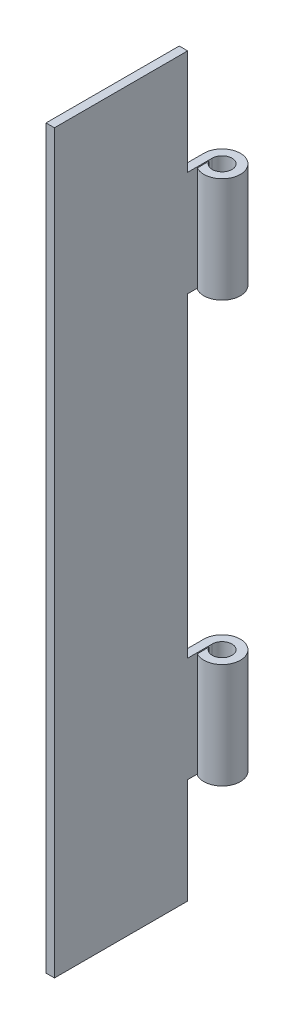
ISO-10303-21;
HEADER;
FILE_DESCRIPTION(('STEP AP214'),'2;1');
FILE_NAME('part.step','',(''),(''),'','','');
FILE_SCHEMA(('AUTOMOTIVE_DESIGN { 1 0 10303 214 1 1 1 1 }'));
ENDSEC;
DATA;
#1=APPLICATION_CONTEXT('core data for automotive mechanical design processes');
#2=APPLICATION_PROTOCOL_DEFINITION('international standard','automotive_design',2000,#1);
#3=PRODUCT_CONTEXT('',#1,'mechanical');
#4=PRODUCT('Part','Part','',(#3));
#5=PRODUCT_RELATED_PRODUCT_CATEGORY('part','',(#4));
#6=PRODUCT_DEFINITION_FORMATION('','',#4);
#7=PRODUCT_DEFINITION_CONTEXT('part definition',#1,'design');
#8=PRODUCT_DEFINITION('design','',#6,#7);
#9=PRODUCT_DEFINITION_SHAPE('','',#8);
#10=(LENGTH_UNIT() NAMED_UNIT(*) SI_UNIT(.MILLI.,.METRE.));
#11=(NAMED_UNIT(*) PLANE_ANGLE_UNIT() SI_UNIT($,.RADIAN.));
#12=(NAMED_UNIT(*) SI_UNIT($,.STERADIAN.) SOLID_ANGLE_UNIT());
#13=UNCERTAINTY_MEASURE_WITH_UNIT(LENGTH_MEASURE(1.E-05),#10,'distance_accuracy_value','');
#14=(GEOMETRIC_REPRESENTATION_CONTEXT(3) GLOBAL_UNCERTAINTY_ASSIGNED_CONTEXT((#13)) GLOBAL_UNIT_ASSIGNED_CONTEXT((#10,
#11,#12)) REPRESENTATION_CONTEXT('',''));
#15=CARTESIAN_POINT('',(0.,0.,0.));
#16=DIRECTION('',(0.,0.,1.));
#17=DIRECTION('',(1.,0.,0.));
#18=AXIS2_PLACEMENT_3D('',#15,#16,#17);
#19=CARTESIAN_POINT('',(0.,88.9,0.));
#20=DIRECTION('',(1.,0.,0.));
#21=DIRECTION('',(0.,0.,-1.));
#22=AXIS2_PLACEMENT_3D('',#19,#20,#21);
#23=PLANE('',#22);
#24=DIRECTION('',(0.,-1.,0.));
#25=VECTOR('',#24,1.);
#26=CARTESIAN_POINT('',(0.,63.5,2.968625));
#27=LINE('',#26,#25);
#28=CARTESIAN_POINT('',(0.,63.5,2.968625));
#29=VERTEX_POINT('',#28);
#30=CARTESIAN_POINT('',(0.,25.4,2.968625));
#31=VERTEX_POINT('',#30);
#32=EDGE_CURVE('E348',#29,#31,#27,.T.);
#33=ORIENTED_EDGE('',*,*,#32,.T.);
#34=DIRECTION('',(0.,0.,-1.));
#35=VECTOR('',#34,1.);
#36=CARTESIAN_POINT('',(0.,25.4,2.968625));
#37=LINE('',#36,#35);
#38=CARTESIAN_POINT('',(0.,25.4,0.));
#39=VERTEX_POINT('',#38);
#40=EDGE_CURVE('E357',#31,#39,#37,.T.);
#41=ORIENTED_EDGE('',*,*,#40,.T.);
#42=DIRECTION('',(0.,-1.,0.));
#43=VECTOR('',#42,1.);
#44=CARTESIAN_POINT('',(0.,88.9,0.));
#45=LINE('',#44,#43);
#46=CARTESIAN_POINT('',(0.,12.7,0.));
#47=VERTEX_POINT('',#46);
#48=EDGE_CURVE('E224',#39,#47,#45,.T.);
#49=ORIENTED_EDGE('',*,*,#48,.T.);
#50=DIRECTION('',(0.,0.,1.));
#51=VECTOR('',#50,1.);
#52=CARTESIAN_POINT('',(0.,12.7,2.968625));
#53=LINE('',#52,#51);
#54=CARTESIAN_POINT('',(0.,12.7,2.968625));
#55=VERTEX_POINT('',#54);
#56=EDGE_CURVE('E179',#47,#55,#53,.T.);
#57=ORIENTED_EDGE('',*,*,#56,.T.);
#58=DIRECTION('',(0.,-1.,0.));
#59=VECTOR('',#58,1.);
#60=CARTESIAN_POINT('',(0.,12.7,2.968625));
#61=LINE('',#60,#59);
#62=CARTESIAN_POINT('',(0.,0.,2.968625));
#63=VERTEX_POINT('',#62);
#64=EDGE_CURVE('E162',#55,#63,#61,.T.);
#65=ORIENTED_EDGE('',*,*,#64,.T.);
#66=DIRECTION('',(0.,0.,1.));
#67=VECTOR('',#66,1.);
#68=CARTESIAN_POINT('',(0.,0.,0.));
#69=LINE('',#68,#67);
#70=CARTESIAN_POINT('',(0.,0.,19.05));
#71=VERTEX_POINT('',#70);
#72=EDGE_CURVE('E176',#63,#71,#69,.T.);
#73=ORIENTED_EDGE('',*,*,#72,.T.);
#74=DIRECTION('',(0.,-1.,0.));
#75=VECTOR('',#74,1.);
#76=CARTESIAN_POINT('',(0.,88.9,19.05));
#77=LINE('',#76,#75);
#78=CARTESIAN_POINT('',(0.,88.9,19.05));
#79=VERTEX_POINT('',#78);
#80=EDGE_CURVE('E221',#79,#71,#77,.T.);
#81=ORIENTED_EDGE('',*,*,#80,.F.);
#82=DIRECTION('',(0.,0.,1.));
#83=VECTOR('',#82,1.);
#84=CARTESIAN_POINT('',(0.,88.9,0.));
#85=LINE('',#84,#83);
#86=CARTESIAN_POINT('',(0.,88.9,2.968625));
#87=VERTEX_POINT('',#86);
#88=EDGE_CURVE('E201',#87,#79,#85,.T.);
#89=ORIENTED_EDGE('',*,*,#88,.F.);
#90=DIRECTION('',(0.,-1.,0.));
#91=VECTOR('',#90,1.);
#92=CARTESIAN_POINT('',(0.,88.9,2.968625));
#93=LINE('',#92,#91);
#94=CARTESIAN_POINT('',(0.,76.2,2.968625));
#95=VERTEX_POINT('',#94);
#96=EDGE_CURVE('E69',#87,#95,#93,.T.);
#97=ORIENTED_EDGE('',*,*,#96,.T.);
#98=DIRECTION('',(0.,0.,-1.));
#99=VECTOR('',#98,1.);
#100=CARTESIAN_POINT('',(0.,76.2,2.968625));
#101=LINE('',#100,#99);
#102=CARTESIAN_POINT('',(0.,76.2,0.));
#103=VERTEX_POINT('',#102);
#104=EDGE_CURVE('E365',#95,#103,#101,.T.);
#105=ORIENTED_EDGE('',*,*,#104,.T.);
#106=CARTESIAN_POINT('',(0.,63.5,0.));
#107=VERTEX_POINT('',#106);
#108=EDGE_CURVE('E172',#103,#107,#45,.T.);
#109=ORIENTED_EDGE('',*,*,#108,.T.);
#110=DIRECTION('',(0.,0.,1.));
#111=VECTOR('',#110,1.);
#112=CARTESIAN_POINT('',(0.,63.5,2.968625));
#113=LINE('',#112,#111);
#114=EDGE_CURVE('E351',#107,#29,#113,.T.);
#115=ORIENTED_EDGE('',*,*,#114,.T.);
#116=EDGE_LOOP('',(#33,#41,#49,#57,#65,#73,#81,#89,#97,#105,#109,#115));
#117=FACE_BOUND('',#116,.T.);
#118=ADVANCED_FACE('F45',(#117),#23,.F.);
#119=CARTESIAN_POINT('',(1.016,88.9,19.05));
#120=DIRECTION('',(-1.,0.,0.));
#121=DIRECTION('',(0.,0.,1.));
#122=AXIS2_PLACEMENT_3D('',#119,#120,#121);
#123=PLANE('',#122);
#124=DIRECTION('',(0.,-1.,0.));
#125=VECTOR('',#124,1.);
#126=CARTESIAN_POINT('',(1.016,88.9,2.968625));
#127=LINE('',#126,#125);
#128=CARTESIAN_POINT('',(1.016,63.5,2.968625));
#129=VERTEX_POINT('',#128);
#130=CARTESIAN_POINT('',(1.016,25.4,2.968625));
#131=VERTEX_POINT('',#130);
#132=EDGE_CURVE('E11',#129,#131,#127,.T.);
#133=ORIENTED_EDGE('',*,*,#132,.F.);
#134=DIRECTION('',(0.,0.,1.));
#135=VECTOR('',#134,1.);
#136=CARTESIAN_POINT('',(1.016,63.5,19.05));
#137=LINE('',#136,#135);
#138=CARTESIAN_POINT('',(1.016,63.5,0.));
#139=VERTEX_POINT('',#138);
#140=EDGE_CURVE('E282',#139,#129,#137,.T.);
#141=ORIENTED_EDGE('',*,*,#140,.F.);
#142=DIRECTION('',(0.,-1.,0.));
#143=VECTOR('',#142,1.);
#144=CARTESIAN_POINT('',(1.016,88.9,0.));
#145=LINE('',#144,#143);
#146=CARTESIAN_POINT('',(1.016,76.2,0.));
#147=VERTEX_POINT('',#146);
#148=EDGE_CURVE('E216',#147,#139,#145,.T.);
#149=ORIENTED_EDGE('',*,*,#148,.F.);
#150=DIRECTION('',(0.,0.,-1.));
#151=VECTOR('',#150,1.);
#152=CARTESIAN_POINT('',(1.016,76.2,19.05));
#153=LINE('',#152,#151);
#154=CARTESIAN_POINT('',(1.016,76.2,2.968625));
#155=VERTEX_POINT('',#154);
#156=EDGE_CURVE('E273',#155,#147,#153,.T.);
#157=ORIENTED_EDGE('',*,*,#156,.F.);
#158=DIRECTION('',(0.,-1.,0.));
#159=VECTOR('',#158,1.);
#160=CARTESIAN_POINT('',(1.016,88.9,2.968625));
#161=LINE('',#160,#159);
#162=CARTESIAN_POINT('',(1.016,88.9,2.968625));
#163=VERTEX_POINT('',#162);
#164=EDGE_CURVE('E305',#163,#155,#161,.T.);
#165=ORIENTED_EDGE('',*,*,#164,.F.);
#166=DIRECTION('',(0.,0.,-1.));
#167=VECTOR('',#166,1.);
#168=CARTESIAN_POINT('',(1.016,88.9,19.05));
#169=LINE('',#168,#167);
#170=CARTESIAN_POINT('',(1.016,88.9,19.05));
#171=VERTEX_POINT('',#170);
#172=EDGE_CURVE('E196',#171,#163,#169,.T.);
#173=ORIENTED_EDGE('',*,*,#172,.F.);
#174=DIRECTION('',(0.,-1.,0.));
#175=VECTOR('',#174,1.);
#176=CARTESIAN_POINT('',(1.016,88.9,19.05));
#177=LINE('',#176,#175);
#178=CARTESIAN_POINT('',(1.016,0.,19.05));
#179=VERTEX_POINT('',#178);
#180=EDGE_CURVE('E217',#171,#179,#177,.T.);
#181=ORIENTED_EDGE('',*,*,#180,.T.);
#182=DIRECTION('',(0.,0.,-1.));
#183=VECTOR('',#182,1.);
#184=CARTESIAN_POINT('',(1.016,0.,19.05));
#185=LINE('',#184,#183);
#186=CARTESIAN_POINT('',(1.016,0.,2.968625));
#187=VERTEX_POINT('',#186);
#188=EDGE_CURVE('E191',#179,#187,#185,.T.);
#189=ORIENTED_EDGE('',*,*,#188,.T.);
#190=DIRECTION('',(0.,-1.,0.));
#191=VECTOR('',#190,1.);
#192=CARTESIAN_POINT('',(1.016,88.9,2.968625));
#193=LINE('',#192,#191);
#194=CARTESIAN_POINT('',(1.016,12.7,2.968625));
#195=VERTEX_POINT('',#194);
#196=EDGE_CURVE('E165',#195,#187,#193,.T.);
#197=ORIENTED_EDGE('',*,*,#196,.F.);
#198=DIRECTION('',(0.,0.,1.));
#199=VECTOR('',#198,1.);
#200=CARTESIAN_POINT('',(1.016,12.7,19.05));
#201=LINE('',#200,#199);
#202=CARTESIAN_POINT('',(1.016,12.7,0.));
#203=VERTEX_POINT('',#202);
#204=EDGE_CURVE('E193',#203,#195,#201,.T.);
#205=ORIENTED_EDGE('',*,*,#204,.F.);
#206=CARTESIAN_POINT('',(1.016,25.4,0.));
#207=VERTEX_POINT('',#206);
#208=EDGE_CURVE('E212',#207,#203,#145,.T.);
#209=ORIENTED_EDGE('',*,*,#208,.F.);
#210=DIRECTION('',(0.,0.,-1.));
#211=VECTOR('',#210,1.);
#212=CARTESIAN_POINT('',(1.016,25.4,19.05));
#213=LINE('',#212,#211);
#214=EDGE_CURVE('E266',#131,#207,#213,.T.);
#215=ORIENTED_EDGE('',*,*,#214,.F.);
#216=EDGE_LOOP('',(#133,#141,#149,#157,#165,#173,#181,#189,#197,#205,#209,#215));
#217=FACE_BOUND('',#216,.T.);
#218=ADVANCED_FACE('F303',(#217),#123,.F.);
#219=CARTESIAN_POINT('',(2.206625,88.9,0.));
#220=DIRECTION('',(0.,-1.,0.));
#221=DIRECTION('',(0.,0.,-1.));
#222=AXIS2_PLACEMENT_3D('',#219,#220,#221);
#223=CYLINDRICAL_SURFACE('',#222,2.206625);
#224=DIRECTION('',(0.,-1.,0.));
#225=VECTOR('',#224,1.);
#226=CARTESIAN_POINT('',(1.143,88.9,1.93336384315007));
#227=LINE('',#226,#225);
#228=CARTESIAN_POINT('',(1.143,25.4,1.93336384315007));
#229=VERTEX_POINT('',#228);
#230=CARTESIAN_POINT('',(1.143,12.7,1.93336384315007));
#231=VERTEX_POINT('',#230);
#232=EDGE_CURVE('E202',#229,#231,#227,.T.);
#233=ORIENTED_EDGE('',*,*,#232,.T.);
#234=CARTESIAN_POINT('',(2.206625,12.7,0.));
#235=DIRECTION('',(0.,-1.,0.));
#236=DIRECTION('',(0.,0.,-1.));
#237=AXIS2_PLACEMENT_3D('',#234,#235,#236);
#238=CIRCLE('',#237,2.206625);
#239=EDGE_CURVE('E187',#47,#231,#238,.T.);
#240=ORIENTED_EDGE('',*,*,#239,.F.);
#241=ORIENTED_EDGE('',*,*,#48,.F.);
#242=CARTESIAN_POINT('',(2.206625,25.4,0.));
#243=DIRECTION('',(0.,1.,0.));
#244=DIRECTION('',(0.,0.,1.));
#245=AXIS2_PLACEMENT_3D('',#242,#243,#244);
#246=CIRCLE('',#245,2.206625);
#247=EDGE_CURVE('E261',#229,#39,#246,.T.);
#248=ORIENTED_EDGE('',*,*,#247,.F.);
#249=EDGE_LOOP('',(#233,#240,#241,#248));
#250=FACE_BOUND('',#249,.T.);
#251=ADVANCED_FACE('F47',(#250),#223,.T.);
#252=CARTESIAN_POINT('',(1.143,76.2,1.93336384315007));
#253=VERTEX_POINT('',#252);
#254=CARTESIAN_POINT('',(1.143,63.5,1.93336384315007));
#255=VERTEX_POINT('',#254);
#256=EDGE_CURVE('E206',#253,#255,#227,.T.);
#257=ORIENTED_EDGE('',*,*,#256,.T.);
#258=CARTESIAN_POINT('',(2.206625,63.5,0.));
#259=DIRECTION('',(0.,-1.,0.));
#260=DIRECTION('',(0.,0.,-1.));
#261=AXIS2_PLACEMENT_3D('',#258,#259,#260);
#262=CIRCLE('',#261,2.206625);
#263=EDGE_CURVE('E61',#107,#255,#262,.T.);
#264=ORIENTED_EDGE('',*,*,#263,.F.);
#265=ORIENTED_EDGE('',*,*,#108,.F.);
#266=CARTESIAN_POINT('',(2.206625,76.2,0.));
#267=DIRECTION('',(0.,1.,0.));
#268=DIRECTION('',(0.,0.,1.));
#269=AXIS2_PLACEMENT_3D('',#266,#267,#268);
#270=CIRCLE('',#269,2.206625);
#271=EDGE_CURVE('E268',#253,#103,#270,.T.);
#272=ORIENTED_EDGE('',*,*,#271,.F.);
#273=EDGE_LOOP('',(#257,#264,#265,#272));
#274=FACE_BOUND('',#273,.T.);
#275=ADVANCED_FACE('F337',(#274),#223,.T.);
#276=CARTESIAN_POINT('',(2.206625,88.9,0.));
#277=DIRECTION('',(0.,-1.,0.));
#278=DIRECTION('',(0.,0.,-1.));
#279=AXIS2_PLACEMENT_3D('',#276,#277,#278);
#280=CYLINDRICAL_SURFACE('',#279,1.190625);
#281=CARTESIAN_POINT('',(2.206625,12.7,0.));
#282=DIRECTION('',(0.,-1.,0.));
#283=DIRECTION('',(0.,0.,-1.));
#284=AXIS2_PLACEMENT_3D('',#281,#282,#283);
#285=CIRCLE('',#284,1.190625);
#286=CARTESIAN_POINT('',(1.143,12.7,0.535060510596702));
#287=VERTEX_POINT('',#286);
#288=EDGE_CURVE('E244',#287,#203,#285,.F.);
#289=ORIENTED_EDGE('',*,*,#288,.F.);
#290=DIRECTION('',(0.,-1.,0.));
#291=VECTOR('',#290,1.);
#292=CARTESIAN_POINT('',(1.143,88.9,0.535060510596702));
#293=LINE('',#292,#291);
#294=CARTESIAN_POINT('',(1.143,25.4,0.535060510596702));
#295=VERTEX_POINT('',#294);
#296=EDGE_CURVE('E207',#295,#287,#293,.T.);
#297=ORIENTED_EDGE('',*,*,#296,.F.);
#298=CARTESIAN_POINT('',(2.206625,25.4,0.));
#299=DIRECTION('',(0.,1.,0.));
#300=DIRECTION('',(0.,0.,1.));
#301=AXIS2_PLACEMENT_3D('',#298,#299,#300);
#302=CIRCLE('',#301,1.190625);
#303=EDGE_CURVE('E263',#207,#295,#302,.F.);
#304=ORIENTED_EDGE('',*,*,#303,.F.);
#305=ORIENTED_EDGE('',*,*,#208,.T.);
#306=EDGE_LOOP('',(#289,#297,#304,#305));
#307=FACE_BOUND('',#306,.T.);
#308=ADVANCED_FACE('F251',(#307),#280,.F.);
#309=CARTESIAN_POINT('',(2.206625,63.5,0.));
#310=DIRECTION('',(0.,-1.,0.));
#311=DIRECTION('',(0.,0.,-1.));
#312=AXIS2_PLACEMENT_3D('',#309,#310,#311);
#313=CIRCLE('',#312,1.190625);
#314=CARTESIAN_POINT('',(1.143,63.5,0.535060510596702));
#315=VERTEX_POINT('',#314);
#316=EDGE_CURVE('E279',#315,#139,#313,.F.);
#317=ORIENTED_EDGE('',*,*,#316,.F.);
#318=CARTESIAN_POINT('',(1.143,76.2,0.535060510596702));
#319=VERTEX_POINT('',#318);
#320=EDGE_CURVE('E211',#319,#315,#293,.T.);
#321=ORIENTED_EDGE('',*,*,#320,.F.);
#322=CARTESIAN_POINT('',(2.206625,76.2,0.));
#323=DIRECTION('',(0.,1.,0.));
#324=DIRECTION('',(0.,0.,1.));
#325=AXIS2_PLACEMENT_3D('',#322,#323,#324);
#326=CIRCLE('',#325,1.190625);
#327=EDGE_CURVE('E309',#147,#319,#326,.F.);
#328=ORIENTED_EDGE('',*,*,#327,.F.);
#329=ORIENTED_EDGE('',*,*,#148,.T.);
#330=EDGE_LOOP('',(#317,#321,#328,#329));
#331=FACE_BOUND('',#330,.T.);
#332=ADVANCED_FACE('F328',(#331),#280,.F.);
#333=CARTESIAN_POINT('',(1.143,88.9,0.535060510596702));
#334=DIRECTION('',(1.,0.,0.));
#335=DIRECTION('',(0.,0.,-1.));
#336=AXIS2_PLACEMENT_3D('',#333,#334,#335);
#337=PLANE('',#336);
#338=DIRECTION('',(0.,0.,-1.));
#339=VECTOR('',#338,1.);
#340=CARTESIAN_POINT('',(1.143,12.7,0.535060510596702));
#341=LINE('',#340,#339);
#342=EDGE_CURVE('E54',#231,#287,#341,.T.);
#343=ORIENTED_EDGE('',*,*,#342,.F.);
#344=ORIENTED_EDGE('',*,*,#232,.F.);
#345=DIRECTION('',(0.,0.,1.));
#346=VECTOR('',#345,1.);
#347=CARTESIAN_POINT('',(1.143,25.4,0.535060510596702));
#348=LINE('',#347,#346);
#349=EDGE_CURVE('E233',#295,#229,#348,.T.);
#350=ORIENTED_EDGE('',*,*,#349,.F.);
#351=ORIENTED_EDGE('',*,*,#296,.T.);
#352=EDGE_LOOP('',(#343,#344,#350,#351));
#353=FACE_BOUND('',#352,.T.);
#354=ADVANCED_FACE('F257',(#353),#337,.F.);
#355=DIRECTION('',(0.,0.,-1.));
#356=VECTOR('',#355,1.);
#357=CARTESIAN_POINT('',(1.143,63.5,0.535060510596702));
#358=LINE('',#357,#356);
#359=EDGE_CURVE('E237',#255,#315,#358,.T.);
#360=ORIENTED_EDGE('',*,*,#359,.F.);
#361=ORIENTED_EDGE('',*,*,#256,.F.);
#362=DIRECTION('',(0.,0.,1.));
#363=VECTOR('',#362,1.);
#364=CARTESIAN_POINT('',(1.143,76.2,0.535060510596702));
#365=LINE('',#364,#363);
#366=EDGE_CURVE('E229',#319,#253,#365,.T.);
#367=ORIENTED_EDGE('',*,*,#366,.F.);
#368=ORIENTED_EDGE('',*,*,#320,.T.);
#369=EDGE_LOOP('',(#360,#361,#367,#368));
#370=FACE_BOUND('',#369,.T.);
#371=ADVANCED_FACE('F341',(#370),#337,.F.);
#372=CARTESIAN_POINT('',(2.206625,88.9,0.));
#373=DIRECTION('',(0.,1.,0.));
#374=DIRECTION('',(0.,0.,1.));
#375=AXIS2_PLACEMENT_3D('',#372,#373,#374);
#376=PLANE('',#375);
#377=ORIENTED_EDGE('',*,*,#172,.T.);
#378=DIRECTION('',(-1.,0.,0.));
#379=VECTOR('',#378,1.);
#380=CARTESIAN_POINT('',(2.206625,88.9,2.968625));
#381=LINE('',#380,#379);
#382=EDGE_CURVE('E171',#163,#87,#381,.T.);
#383=ORIENTED_EDGE('',*,*,#382,.T.);
#384=ORIENTED_EDGE('',*,*,#88,.T.);
#385=DIRECTION('',(1.,0.,0.));
#386=VECTOR('',#385,1.);
#387=CARTESIAN_POINT('',(0.,88.9,19.05));
#388=LINE('',#387,#386);
#389=EDGE_CURVE('E291',#79,#171,#388,.T.);
#390=ORIENTED_EDGE('',*,*,#389,.T.);
#391=EDGE_LOOP('',(#377,#383,#384,#390));
#392=FACE_BOUND('',#391,.T.);
#393=ADVANCED_FACE('F299',(#392),#376,.T.);
#394=CARTESIAN_POINT('',(2.206625,0.,0.));
#395=DIRECTION('',(0.,1.,0.));
#396=DIRECTION('',(0.,0.,1.));
#397=AXIS2_PLACEMENT_3D('',#394,#395,#396);
#398=PLANE('',#397);
#399=DIRECTION('',(-1.,0.,0.));
#400=VECTOR('',#399,1.);
#401=CARTESIAN_POINT('',(2.206625,0.,2.968625));
#402=LINE('',#401,#400);
#403=EDGE_CURVE('E158',#187,#63,#402,.T.);
#404=ORIENTED_EDGE('',*,*,#403,.F.);
#405=ORIENTED_EDGE('',*,*,#188,.F.);
#406=DIRECTION('',(1.,0.,0.));
#407=VECTOR('',#406,1.);
#408=CARTESIAN_POINT('',(0.,0.,19.05));
#409=LINE('',#408,#407);
#410=EDGE_CURVE('E185',#71,#179,#409,.T.);
#411=ORIENTED_EDGE('',*,*,#410,.F.);
#412=ORIENTED_EDGE('',*,*,#72,.F.);
#413=EDGE_LOOP('',(#404,#405,#411,#412));
#414=FACE_BOUND('',#413,.T.);
#415=ADVANCED_FACE('F184',(#414),#398,.F.);
#416=CARTESIAN_POINT('',(0.,88.9,19.05));
#417=DIRECTION('',(0.,0.,-1.));
#418=DIRECTION('',(-1.,0.,0.));
#419=AXIS2_PLACEMENT_3D('',#416,#417,#418);
#420=PLANE('',#419);
#421=ORIENTED_EDGE('',*,*,#410,.T.);
#422=ORIENTED_EDGE('',*,*,#180,.F.);
#423=ORIENTED_EDGE('',*,*,#389,.F.);
#424=ORIENTED_EDGE('',*,*,#80,.T.);
#425=EDGE_LOOP('',(#421,#422,#423,#424));
#426=FACE_BOUND('',#425,.T.);
#427=ADVANCED_FACE('F371',(#426),#420,.F.);
#428=CARTESIAN_POINT('',(4.41325,12.7,2.968625));
#429=DIRECTION('',(0.,-1.,0.));
#430=DIRECTION('',(0.,0.,-1.));
#431=AXIS2_PLACEMENT_3D('',#428,#429,#430);
#432=PLANE('',#431);
#433=ORIENTED_EDGE('',*,*,#239,.T.);
#434=ORIENTED_EDGE('',*,*,#342,.T.);
#435=ORIENTED_EDGE('',*,*,#288,.T.);
#436=ORIENTED_EDGE('',*,*,#204,.T.);
#437=DIRECTION('',(-1.,0.,0.));
#438=VECTOR('',#437,1.);
#439=CARTESIAN_POINT('',(4.41325,12.7,2.968625));
#440=LINE('',#439,#438);
#441=EDGE_CURVE('E314',#195,#55,#440,.T.);
#442=ORIENTED_EDGE('',*,*,#441,.T.);
#443=ORIENTED_EDGE('',*,*,#56,.F.);
#444=EDGE_LOOP('',(#433,#434,#435,#436,#442,#443));
#445=FACE_BOUND('',#444,.T.);
#446=ADVANCED_FACE('F243',(#445),#432,.T.);
#447=CARTESIAN_POINT('',(4.41325,12.7,2.968625));
#448=DIRECTION('',(0.,0.,-1.));
#449=DIRECTION('',(0.,1.,0.));
#450=AXIS2_PLACEMENT_3D('',#447,#448,#449);
#451=PLANE('',#450);
#452=ORIENTED_EDGE('',*,*,#196,.T.);
#453=ORIENTED_EDGE('',*,*,#403,.T.);
#454=ORIENTED_EDGE('',*,*,#64,.F.);
#455=ORIENTED_EDGE('',*,*,#441,.F.);
#456=EDGE_LOOP('',(#452,#453,#454,#455));
#457=FACE_BOUND('',#456,.T.);
#458=ADVANCED_FACE('F160',(#457),#451,.T.);
#459=CARTESIAN_POINT('',(4.41325,76.2,2.968625));
#460=DIRECTION('',(0.,1.,0.));
#461=DIRECTION('',(0.,0.,1.));
#462=AXIS2_PLACEMENT_3D('',#459,#460,#461);
#463=PLANE('',#462);
#464=ORIENTED_EDGE('',*,*,#271,.T.);
#465=ORIENTED_EDGE('',*,*,#104,.F.);
#466=DIRECTION('',(-1.,0.,0.));
#467=VECTOR('',#466,1.);
#468=CARTESIAN_POINT('',(4.41325,76.2,2.968625));
#469=LINE('',#468,#467);
#470=EDGE_CURVE('E323',#155,#95,#469,.T.);
#471=ORIENTED_EDGE('',*,*,#470,.F.);
#472=ORIENTED_EDGE('',*,*,#156,.T.);
#473=ORIENTED_EDGE('',*,*,#327,.T.);
#474=ORIENTED_EDGE('',*,*,#366,.T.);
#475=EDGE_LOOP('',(#464,#465,#471,#472,#473,#474));
#476=FACE_BOUND('',#475,.T.);
#477=ADVANCED_FACE('F320',(#476),#463,.T.);
#478=CARTESIAN_POINT('',(4.41325,88.9,2.968625));
#479=DIRECTION('',(0.,0.,-1.));
#480=DIRECTION('',(0.,1.,0.));
#481=AXIS2_PLACEMENT_3D('',#478,#479,#480);
#482=PLANE('',#481);
#483=ORIENTED_EDGE('',*,*,#164,.T.);
#484=ORIENTED_EDGE('',*,*,#470,.T.);
#485=ORIENTED_EDGE('',*,*,#96,.F.);
#486=ORIENTED_EDGE('',*,*,#382,.F.);
#487=EDGE_LOOP('',(#483,#484,#485,#486));
#488=FACE_BOUND('',#487,.T.);
#489=ADVANCED_FACE('F369',(#488),#482,.T.);
#490=CARTESIAN_POINT('',(4.41325,25.4,2.968625));
#491=DIRECTION('',(0.,1.,0.));
#492=DIRECTION('',(0.,0.,1.));
#493=AXIS2_PLACEMENT_3D('',#490,#491,#492);
#494=PLANE('',#493);
#495=ORIENTED_EDGE('',*,*,#247,.T.);
#496=ORIENTED_EDGE('',*,*,#40,.F.);
#497=DIRECTION('',(-1.,0.,0.));
#498=VECTOR('',#497,1.);
#499=CARTESIAN_POINT('',(4.41325,25.4,2.968625));
#500=LINE('',#499,#498);
#501=EDGE_CURVE('E360',#131,#31,#500,.T.);
#502=ORIENTED_EDGE('',*,*,#501,.F.);
#503=ORIENTED_EDGE('',*,*,#214,.T.);
#504=ORIENTED_EDGE('',*,*,#303,.T.);
#505=ORIENTED_EDGE('',*,*,#349,.T.);
#506=EDGE_LOOP('',(#495,#496,#502,#503,#504,#505));
#507=FACE_BOUND('',#506,.T.);
#508=ADVANCED_FACE('F259',(#507),#494,.T.);
#509=CARTESIAN_POINT('',(4.41325,63.5,2.968625));
#510=DIRECTION('',(0.,0.,-1.));
#511=DIRECTION('',(0.,1.,0.));
#512=AXIS2_PLACEMENT_3D('',#509,#510,#511);
#513=PLANE('',#512);
#514=DIRECTION('',(-1.,0.,0.));
#515=VECTOR('',#514,1.);
#516=CARTESIAN_POINT('',(4.41325,63.5,2.968625));
#517=LINE('',#516,#515);
#518=EDGE_CURVE('E181',#129,#29,#517,.T.);
#519=ORIENTED_EDGE('',*,*,#518,.F.);
#520=ORIENTED_EDGE('',*,*,#132,.T.);
#521=ORIENTED_EDGE('',*,*,#501,.T.);
#522=ORIENTED_EDGE('',*,*,#32,.F.);
#523=EDGE_LOOP('',(#519,#520,#521,#522));
#524=FACE_BOUND('',#523,.T.);
#525=ADVANCED_FACE('F346',(#524),#513,.T.);
#526=CARTESIAN_POINT('',(4.41325,63.5,2.968625));
#527=DIRECTION('',(0.,-1.,0.));
#528=DIRECTION('',(0.,0.,-1.));
#529=AXIS2_PLACEMENT_3D('',#526,#527,#528);
#530=PLANE('',#529);
#531=ORIENTED_EDGE('',*,*,#263,.T.);
#532=ORIENTED_EDGE('',*,*,#359,.T.);
#533=ORIENTED_EDGE('',*,*,#316,.T.);
#534=ORIENTED_EDGE('',*,*,#140,.T.);
#535=ORIENTED_EDGE('',*,*,#518,.T.);
#536=ORIENTED_EDGE('',*,*,#114,.F.);
#537=EDGE_LOOP('',(#531,#532,#533,#534,#535,#536));
#538=FACE_BOUND('',#537,.T.);
#539=ADVANCED_FACE('F342',(#538),#530,.T.);
#540=CLOSED_SHELL('',(#118,#218,#251,#275,#308,#332,#354,#371,#393,#415,#427,#446,#458,#477,
#489,#508,#525,#539));
#541=MANIFOLD_SOLID_BREP('B2',#540);
#542=ADVANCED_BREP_SHAPE_REPRESENTATION('',(#18,#541),#14);
#543=SHAPE_DEFINITION_REPRESENTATION(#9,#542);
ENDSEC;
END-ISO-10303-21;
